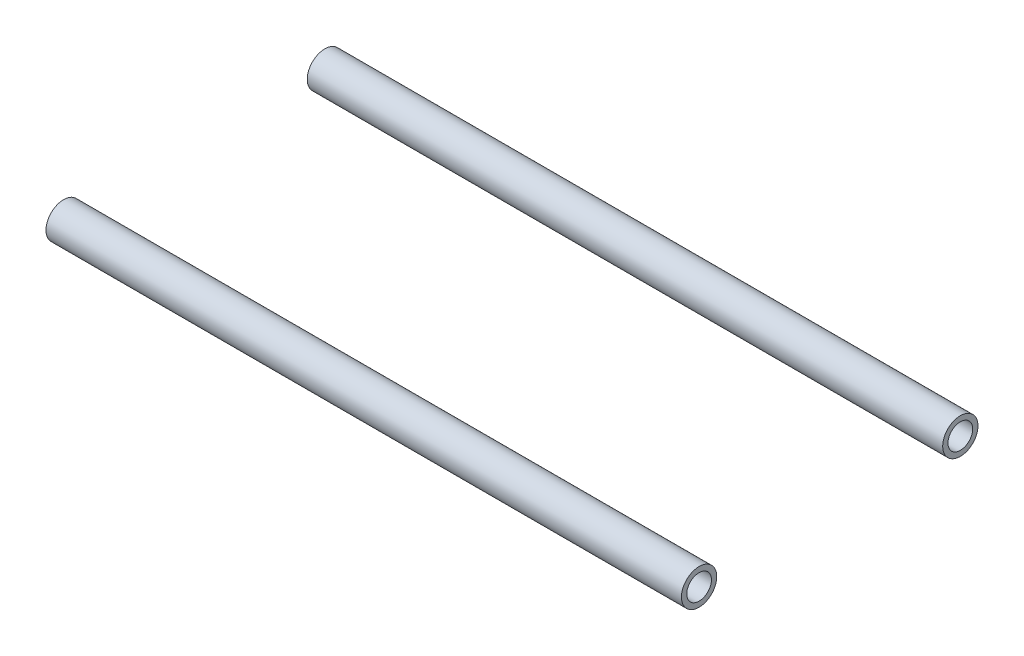
ISO-10303-21;
HEADER;
FILE_DESCRIPTION(('STEP AP214'),'2;1');
FILE_NAME('part.step','',(''),(''),'','','');
FILE_SCHEMA(('AUTOMOTIVE_DESIGN { 1 0 10303 214 1 1 1 1 }'));
ENDSEC;
DATA;
#1=APPLICATION_CONTEXT('core data for automotive mechanical design processes');
#2=APPLICATION_PROTOCOL_DEFINITION('international standard','automotive_design',2000,#1);
#3=PRODUCT_CONTEXT('',#1,'mechanical');
#4=PRODUCT('Part','Part','',(#3));
#5=PRODUCT_RELATED_PRODUCT_CATEGORY('part','',(#4));
#6=PRODUCT_DEFINITION_FORMATION('','',#4);
#7=PRODUCT_DEFINITION_CONTEXT('part definition',#1,'design');
#8=PRODUCT_DEFINITION('design','',#6,#7);
#9=PRODUCT_DEFINITION_SHAPE('','',#8);
#10=(LENGTH_UNIT() NAMED_UNIT(*) SI_UNIT(.MILLI.,.METRE.));
#11=(NAMED_UNIT(*) PLANE_ANGLE_UNIT() SI_UNIT($,.RADIAN.));
#12=(NAMED_UNIT(*) SI_UNIT($,.STERADIAN.) SOLID_ANGLE_UNIT());
#13=UNCERTAINTY_MEASURE_WITH_UNIT(LENGTH_MEASURE(1.E-05),#10,'distance_accuracy_value','');
#14=(GEOMETRIC_REPRESENTATION_CONTEXT(3) GLOBAL_UNCERTAINTY_ASSIGNED_CONTEXT((#13)) GLOBAL_UNIT_ASSIGNED_CONTEXT((#10,
#11,#12)) REPRESENTATION_CONTEXT('',''));
#15=CARTESIAN_POINT('',(0.,0.,0.));
#16=DIRECTION('',(0.,0.,1.));
#17=DIRECTION('',(1.,0.,0.));
#18=AXIS2_PLACEMENT_3D('',#15,#16,#17);
#19=CARTESIAN_POINT('',(0.,2240.,370.));
#20=DIRECTION('',(1.,0.,0.));
#21=DIRECTION('',(0.,0.,-1.));
#22=AXIS2_PLACEMENT_3D('',#19,#20,#21);
#23=CYLINDRICAL_SURFACE('',#22,50.0000000000001);
#24=CARTESIAN_POINT('',(1800.,2240.,370.));
#25=DIRECTION('',(1.,0.,0.));
#26=DIRECTION('',(0.,0.,-1.));
#27=AXIS2_PLACEMENT_3D('',#24,#25,#26);
#28=CIRCLE('',#27,50.0000000000001);
#29=CARTESIAN_POINT('',(1800.,2240.,320.));
#30=VERTEX_POINT('',#29);
#31=EDGE_CURVE('E51',#30,#30,#28,.T.);
#32=ORIENTED_EDGE('',*,*,#31,.F.);
#33=EDGE_LOOP('',(#32));
#34=FACE_BOUND('',#33,.T.);
#35=CARTESIAN_POINT('',(0.,2240.,370.));
#36=DIRECTION('',(1.,0.,0.));
#37=DIRECTION('',(0.,0.,-1.));
#38=AXIS2_PLACEMENT_3D('',#35,#36,#37);
#39=CIRCLE('',#38,50.0000000000001);
#40=CARTESIAN_POINT('',(0.,2240.,320.));
#41=VERTEX_POINT('',#40);
#42=EDGE_CURVE('E42',#41,#41,#39,.T.);
#43=ORIENTED_EDGE('',*,*,#42,.T.);
#44=EDGE_LOOP('',(#43));
#45=FACE_BOUND('',#44,.T.);
#46=ADVANCED_FACE('F39',(#34,#45),#23,.T.);
#47=CARTESIAN_POINT('',(0.,2240.,370.));
#48=DIRECTION('',(1.,0.,0.));
#49=DIRECTION('',(0.,0.,-1.));
#50=AXIS2_PLACEMENT_3D('',#47,#48,#49);
#51=PLANE('',#50);
#52=CARTESIAN_POINT('',(0.,2240.,370.));
#53=DIRECTION('',(1.,0.,0.));
#54=DIRECTION('',(0.,0.,-1.));
#55=AXIS2_PLACEMENT_3D('',#52,#53,#54);
#56=CIRCLE('',#55,35.);
#57=CARTESIAN_POINT('',(0.,2240.,335.));
#58=VERTEX_POINT('',#57);
#59=EDGE_CURVE('E46',#58,#58,#56,.F.);
#60=ORIENTED_EDGE('',*,*,#59,.F.);
#61=EDGE_LOOP('',(#60));
#62=FACE_BOUND('',#61,.T.);
#63=ORIENTED_EDGE('',*,*,#42,.F.);
#64=EDGE_LOOP('',(#63));
#65=FACE_BOUND('',#64,.T.);
#66=ADVANCED_FACE('F60',(#62,#65),#51,.F.);
#67=CARTESIAN_POINT('',(1800.,2240.,370.));
#68=DIRECTION('',(1.,0.,0.));
#69=DIRECTION('',(0.,0.,-1.));
#70=AXIS2_PLACEMENT_3D('',#67,#68,#69);
#71=PLANE('',#70);
#72=CARTESIAN_POINT('',(1800.,2240.,370.));
#73=DIRECTION('',(1.,0.,0.));
#74=DIRECTION('',(0.,0.,-1.));
#75=AXIS2_PLACEMENT_3D('',#72,#73,#74);
#76=CIRCLE('',#75,35.);
#77=CARTESIAN_POINT('',(1800.,2240.,335.));
#78=VERTEX_POINT('',#77);
#79=EDGE_CURVE('E11',#78,#78,#76,.F.);
#80=ORIENTED_EDGE('',*,*,#79,.T.);
#81=EDGE_LOOP('',(#80));
#82=FACE_BOUND('',#81,.T.);
#83=ORIENTED_EDGE('',*,*,#31,.T.);
#84=EDGE_LOOP('',(#83));
#85=FACE_BOUND('',#84,.T.);
#86=ADVANCED_FACE('F62',(#82,#85),#71,.T.);
#87=CARTESIAN_POINT('',(0.,2240.,370.));
#88=DIRECTION('',(1.,0.,0.));
#89=DIRECTION('',(0.,0.,-1.));
#90=AXIS2_PLACEMENT_3D('',#87,#88,#89);
#91=CYLINDRICAL_SURFACE('',#90,35.);
#92=ORIENTED_EDGE('',*,*,#79,.F.);
#93=EDGE_LOOP('',(#92));
#94=FACE_BOUND('',#93,.T.);
#95=ORIENTED_EDGE('',*,*,#59,.T.);
#96=EDGE_LOOP('',(#95));
#97=FACE_BOUND('',#96,.T.);
#98=ADVANCED_FACE('F68',(#94,#97),#91,.F.);
#99=CLOSED_SHELL('',(#46,#66,#86,#98));
#100=MANIFOLD_SOLID_BREP('B2',#99);
#101=CARTESIAN_POINT('',(1800.,2240.,-370.));
#102=DIRECTION('',(-1.,0.,0.));
#103=DIRECTION('',(0.,0.,1.));
#104=AXIS2_PLACEMENT_3D('',#101,#102,#103);
#105=CYLINDRICAL_SURFACE('',#104,50.0000000000001);
#106=CARTESIAN_POINT('',(0.,2240.,-370.));
#107=DIRECTION('',(1.,0.,0.));
#108=DIRECTION('',(0.,0.,-1.));
#109=AXIS2_PLACEMENT_3D('',#106,#107,#108);
#110=CIRCLE('',#109,50.0000000000001);
#111=CARTESIAN_POINT('',(0.,2240.,-420.));
#112=VERTEX_POINT('',#111);
#113=EDGE_CURVE('E113',#112,#112,#110,.T.);
#114=ORIENTED_EDGE('',*,*,#113,.T.);
#115=EDGE_LOOP('',(#114));
#116=FACE_BOUND('',#115,.T.);
#117=CARTESIAN_POINT('',(1800.,2240.,-370.));
#118=DIRECTION('',(1.,0.,0.));
#119=DIRECTION('',(0.,0.,-1.));
#120=AXIS2_PLACEMENT_3D('',#117,#118,#119);
#121=CIRCLE('',#120,50.0000000000001);
#122=CARTESIAN_POINT('',(1800.,2240.,-420.));
#123=VERTEX_POINT('',#122);
#124=EDGE_CURVE('E104',#123,#123,#121,.T.);
#125=ORIENTED_EDGE('',*,*,#124,.F.);
#126=EDGE_LOOP('',(#125));
#127=FACE_BOUND('',#126,.T.);
#128=ADVANCED_FACE('F101',(#116,#127),#105,.T.);
#129=CARTESIAN_POINT('',(1800.,2240.,-370.));
#130=DIRECTION('',(1.,0.,0.));
#131=DIRECTION('',(0.,0.,-1.));
#132=AXIS2_PLACEMENT_3D('',#129,#130,#131);
#133=PLANE('',#132);
#134=CARTESIAN_POINT('',(1800.,2240.,-370.));
#135=DIRECTION('',(1.,0.,0.));
#136=DIRECTION('',(0.,0.,-1.));
#137=AXIS2_PLACEMENT_3D('',#134,#135,#136);
#138=CIRCLE('',#137,35.);
#139=CARTESIAN_POINT('',(1800.,2240.,-405.));
#140=VERTEX_POINT('',#139);
#141=EDGE_CURVE('E108',#140,#140,#138,.F.);
#142=ORIENTED_EDGE('',*,*,#141,.T.);
#143=EDGE_LOOP('',(#142));
#144=FACE_BOUND('',#143,.T.);
#145=ORIENTED_EDGE('',*,*,#124,.T.);
#146=EDGE_LOOP('',(#145));
#147=FACE_BOUND('',#146,.T.);
#148=ADVANCED_FACE('F121',(#144,#147),#133,.T.);
#149=CARTESIAN_POINT('',(0.,2240.,-370.));
#150=DIRECTION('',(1.,0.,0.));
#151=DIRECTION('',(0.,0.,-1.));
#152=AXIS2_PLACEMENT_3D('',#149,#150,#151);
#153=PLANE('',#152);
#154=CARTESIAN_POINT('',(0.,2240.,-370.));
#155=DIRECTION('',(1.,0.,0.));
#156=DIRECTION('',(0.,0.,-1.));
#157=AXIS2_PLACEMENT_3D('',#154,#155,#156);
#158=CIRCLE('',#157,35.);
#159=CARTESIAN_POINT('',(0.,2240.,-405.));
#160=VERTEX_POINT('',#159);
#161=EDGE_CURVE('E38',#160,#160,#158,.F.);
#162=ORIENTED_EDGE('',*,*,#161,.F.);
#163=EDGE_LOOP('',(#162));
#164=FACE_BOUND('',#163,.T.);
#165=ORIENTED_EDGE('',*,*,#113,.F.);
#166=EDGE_LOOP('',(#165));
#167=FACE_BOUND('',#166,.T.);
#168=ADVANCED_FACE('F127',(#164,#167),#153,.F.);
#169=CARTESIAN_POINT('',(1800.,2240.,-370.));
#170=DIRECTION('',(-1.,0.,0.));
#171=DIRECTION('',(0.,0.,1.));
#172=AXIS2_PLACEMENT_3D('',#169,#170,#171);
#173=CYLINDRICAL_SURFACE('',#172,35.);
#174=ORIENTED_EDGE('',*,*,#161,.T.);
#175=EDGE_LOOP('',(#174));
#176=FACE_BOUND('',#175,.T.);
#177=ORIENTED_EDGE('',*,*,#141,.F.);
#178=EDGE_LOOP('',(#177));
#179=FACE_BOUND('',#178,.T.);
#180=ADVANCED_FACE('F129',(#176,#179),#173,.F.);
#181=CLOSED_SHELL('',(#128,#148,#168,#180));
#182=MANIFOLD_SOLID_BREP('B6',#181);
#183=ADVANCED_BREP_SHAPE_REPRESENTATION('',(#18,#100,#182),#14);
#184=SHAPE_DEFINITION_REPRESENTATION(#9,#183);
ENDSEC;
END-ISO-10303-21;
